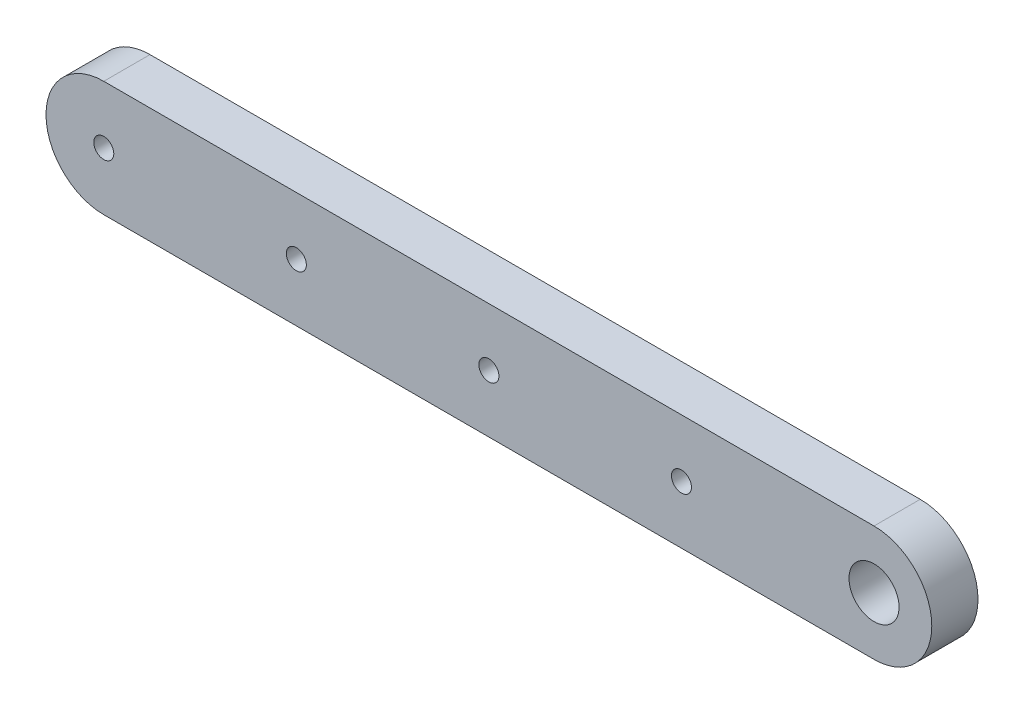
ISO-10303-21;
HEADER;
FILE_DESCRIPTION(('STEP AP214'),'2;1');
FILE_NAME('part.step','',(''),(''),'','','');
FILE_SCHEMA(('AUTOMOTIVE_DESIGN { 1 0 10303 214 1 1 1 1 }'));
ENDSEC;
DATA;
#1=APPLICATION_CONTEXT('core data for automotive mechanical design processes');
#2=APPLICATION_PROTOCOL_DEFINITION('international standard','automotive_design',2000,#1);
#3=PRODUCT_CONTEXT('',#1,'mechanical');
#4=PRODUCT('Part','Part','',(#3));
#5=PRODUCT_RELATED_PRODUCT_CATEGORY('part','',(#4));
#6=PRODUCT_DEFINITION_FORMATION('','',#4);
#7=PRODUCT_DEFINITION_CONTEXT('part definition',#1,'design');
#8=PRODUCT_DEFINITION('design','',#6,#7);
#9=PRODUCT_DEFINITION_SHAPE('','',#8);
#10=(LENGTH_UNIT() NAMED_UNIT(*) SI_UNIT(.MILLI.,.METRE.));
#11=(NAMED_UNIT(*) PLANE_ANGLE_UNIT() SI_UNIT($,.RADIAN.));
#12=(NAMED_UNIT(*) SI_UNIT($,.STERADIAN.) SOLID_ANGLE_UNIT());
#13=UNCERTAINTY_MEASURE_WITH_UNIT(LENGTH_MEASURE(1.E-05),#10,'distance_accuracy_value','');
#14=(GEOMETRIC_REPRESENTATION_CONTEXT(3) GLOBAL_UNCERTAINTY_ASSIGNED_CONTEXT((#13)) GLOBAL_UNIT_ASSIGNED_CONTEXT((#10,
#11,#12)) REPRESENTATION_CONTEXT('',''));
#15=CARTESIAN_POINT('',(0.,0.,0.));
#16=DIRECTION('',(0.,0.,1.));
#17=DIRECTION('',(1.,0.,0.));
#18=AXIS2_PLACEMENT_3D('',#15,#16,#17);
#19=CARTESIAN_POINT('',(0.,-7.5,6.));
#20=DIRECTION('',(0.,-1.,0.));
#21=DIRECTION('',(0.,0.,-1.));
#22=AXIS2_PLACEMENT_3D('',#19,#20,#21);
#23=PLANE('',#22);
#24=DIRECTION('',(-1.,0.,0.));
#25=VECTOR('',#24,1.);
#26=CARTESIAN_POINT('',(0.,-7.5,0.));
#27=LINE('',#26,#25);
#28=CARTESIAN_POINT('',(100.,-7.50000000000001,0.));
#29=VERTEX_POINT('',#28);
#30=CARTESIAN_POINT('',(0.,-7.5,0.));
#31=VERTEX_POINT('',#30);
#32=EDGE_CURVE('E110',#29,#31,#27,.T.);
#33=ORIENTED_EDGE('',*,*,#32,.F.);
#34=DIRECTION('',(0.,0.,-1.));
#35=VECTOR('',#34,1.);
#36=CARTESIAN_POINT('',(100.,-7.50000000000001,6.));
#37=LINE('',#36,#35);
#38=CARTESIAN_POINT('',(100.,-7.50000000000001,6.));
#39=VERTEX_POINT('',#38);
#40=EDGE_CURVE('E11',#39,#29,#37,.T.);
#41=ORIENTED_EDGE('',*,*,#40,.F.);
#42=DIRECTION('',(-1.,0.,0.));
#43=VECTOR('',#42,1.);
#44=CARTESIAN_POINT('',(0.,-7.5,6.));
#45=LINE('',#44,#43);
#46=CARTESIAN_POINT('',(0.,-7.5,6.));
#47=VERTEX_POINT('',#46);
#48=EDGE_CURVE('E91',#39,#47,#45,.T.);
#49=ORIENTED_EDGE('',*,*,#48,.T.);
#50=DIRECTION('',(0.,0.,-1.));
#51=VECTOR('',#50,1.);
#52=CARTESIAN_POINT('',(0.,-7.5,6.));
#53=LINE('',#52,#51);
#54=EDGE_CURVE('E81',#47,#31,#53,.T.);
#55=ORIENTED_EDGE('',*,*,#54,.T.);
#56=EDGE_LOOP('',(#33,#41,#49,#55));
#57=FACE_BOUND('',#56,.T.);
#58=ADVANCED_FACE('F42',(#57),#23,.T.);
#59=CARTESIAN_POINT('',(100.,0.,6.));
#60=DIRECTION('',(0.,0.,-1.));
#61=DIRECTION('',(-1.,0.,0.));
#62=AXIS2_PLACEMENT_3D('',#59,#60,#61);
#63=CYLINDRICAL_SURFACE('',#62,7.50000000000001);
#64=CARTESIAN_POINT('',(100.,0.,0.));
#65=DIRECTION('',(0.,0.,1.));
#66=DIRECTION('',(1.,0.,0.));
#67=AXIS2_PLACEMENT_3D('',#64,#65,#66);
#68=CIRCLE('',#67,7.50000000000001);
#69=CARTESIAN_POINT('',(100.,7.50000000000001,0.));
#70=VERTEX_POINT('',#69);
#71=EDGE_CURVE('E98',#29,#70,#68,.T.);
#72=ORIENTED_EDGE('',*,*,#71,.T.);
#73=DIRECTION('',(0.,0.,-1.));
#74=VECTOR('',#73,1.);
#75=CARTESIAN_POINT('',(100.,7.50000000000001,6.));
#76=LINE('',#75,#74);
#77=CARTESIAN_POINT('',(100.,7.50000000000001,6.));
#78=VERTEX_POINT('',#77);
#79=EDGE_CURVE('E51',#78,#70,#76,.T.);
#80=ORIENTED_EDGE('',*,*,#79,.F.);
#81=CARTESIAN_POINT('',(100.,0.,6.));
#82=DIRECTION('',(0.,0.,1.));
#83=DIRECTION('',(1.,0.,0.));
#84=AXIS2_PLACEMENT_3D('',#81,#82,#83);
#85=CIRCLE('',#84,7.50000000000001);
#86=EDGE_CURVE('E86',#39,#78,#85,.T.);
#87=ORIENTED_EDGE('',*,*,#86,.F.);
#88=ORIENTED_EDGE('',*,*,#40,.T.);
#89=EDGE_LOOP('',(#72,#80,#87,#88));
#90=FACE_BOUND('',#89,.T.);
#91=ADVANCED_FACE('F96',(#90),#63,.T.);
#92=CARTESIAN_POINT('',(0.,7.5,6.));
#93=DIRECTION('',(0.,1.,0.));
#94=DIRECTION('',(0.,0.,1.));
#95=AXIS2_PLACEMENT_3D('',#92,#93,#94);
#96=PLANE('',#95);
#97=DIRECTION('',(1.,0.,0.));
#98=VECTOR('',#97,1.);
#99=CARTESIAN_POINT('',(0.,7.5,0.));
#100=LINE('',#99,#98);
#101=CARTESIAN_POINT('',(0.,7.5,0.));
#102=VERTEX_POINT('',#101);
#103=EDGE_CURVE('E117',#102,#70,#100,.T.);
#104=ORIENTED_EDGE('',*,*,#103,.F.);
#105=DIRECTION('',(0.,0.,-1.));
#106=VECTOR('',#105,1.);
#107=CARTESIAN_POINT('',(0.,7.5,6.));
#108=LINE('',#107,#106);
#109=CARTESIAN_POINT('',(0.,7.5,6.));
#110=VERTEX_POINT('',#109);
#111=EDGE_CURVE('E74',#110,#102,#108,.T.);
#112=ORIENTED_EDGE('',*,*,#111,.F.);
#113=DIRECTION('',(1.,0.,0.));
#114=VECTOR('',#113,1.);
#115=CARTESIAN_POINT('',(0.,7.5,6.));
#116=LINE('',#115,#114);
#117=EDGE_CURVE('E90',#110,#78,#116,.T.);
#118=ORIENTED_EDGE('',*,*,#117,.T.);
#119=ORIENTED_EDGE('',*,*,#79,.T.);
#120=EDGE_LOOP('',(#104,#112,#118,#119));
#121=FACE_BOUND('',#120,.T.);
#122=ADVANCED_FACE('F103',(#121),#96,.T.);
#123=CARTESIAN_POINT('',(0.,0.,6.));
#124=DIRECTION('',(0.,0.,-1.));
#125=DIRECTION('',(-1.,0.,0.));
#126=AXIS2_PLACEMENT_3D('',#123,#124,#125);
#127=CYLINDRICAL_SURFACE('',#126,7.5);
#128=CARTESIAN_POINT('',(0.,0.,0.));
#129=DIRECTION('',(0.,0.,1.));
#130=DIRECTION('',(1.,0.,0.));
#131=AXIS2_PLACEMENT_3D('',#128,#129,#130);
#132=CIRCLE('',#131,7.5);
#133=EDGE_CURVE('E120',#102,#31,#132,.T.);
#134=ORIENTED_EDGE('',*,*,#133,.T.);
#135=ORIENTED_EDGE('',*,*,#54,.F.);
#136=CARTESIAN_POINT('',(0.,0.,6.));
#137=DIRECTION('',(0.,0.,1.));
#138=DIRECTION('',(1.,0.,0.));
#139=AXIS2_PLACEMENT_3D('',#136,#137,#138);
#140=CIRCLE('',#139,7.5);
#141=EDGE_CURVE('E59',#110,#47,#140,.T.);
#142=ORIENTED_EDGE('',*,*,#141,.F.);
#143=ORIENTED_EDGE('',*,*,#111,.T.);
#144=EDGE_LOOP('',(#134,#135,#142,#143));
#145=FACE_BOUND('',#144,.T.);
#146=ADVANCED_FACE('F180',(#145),#127,.T.);
#147=CARTESIAN_POINT('',(0.,0.,6.));
#148=DIRECTION('',(0.,0.,1.));
#149=DIRECTION('',(1.,0.,0.));
#150=AXIS2_PLACEMENT_3D('',#147,#148,#149);
#151=PLANE('',#150);
#152=CARTESIAN_POINT('',(100.,0.,6.));
#153=DIRECTION('',(0.,0.,1.));
#154=DIRECTION('',(1.,0.,0.));
#155=AXIS2_PLACEMENT_3D('',#152,#153,#154);
#156=CIRCLE('',#155,3.25000000000001);
#157=CARTESIAN_POINT('',(103.25,0.,6.));
#158=VERTEX_POINT('',#157);
#159=EDGE_CURVE('E160',#158,#158,#156,.T.);
#160=ORIENTED_EDGE('',*,*,#159,.F.);
#161=EDGE_LOOP('',(#160));
#162=FACE_BOUND('',#161,.T.);
#163=CARTESIAN_POINT('',(25.,0.,6.));
#164=DIRECTION('',(0.,0.,1.));
#165=DIRECTION('',(1.,0.,0.));
#166=AXIS2_PLACEMENT_3D('',#163,#164,#165);
#167=CIRCLE('',#166,1.3);
#168=CARTESIAN_POINT('',(26.3,0.,6.));
#169=VERTEX_POINT('',#168);
#170=EDGE_CURVE('E145',#169,#169,#167,.T.);
#171=ORIENTED_EDGE('',*,*,#170,.F.);
#172=EDGE_LOOP('',(#171));
#173=FACE_BOUND('',#172,.T.);
#174=CARTESIAN_POINT('',(75.,0.,6.));
#175=DIRECTION('',(0.,0.,1.));
#176=DIRECTION('',(1.,0.,0.));
#177=AXIS2_PLACEMENT_3D('',#174,#175,#176);
#178=CIRCLE('',#177,1.3);
#179=CARTESIAN_POINT('',(76.3,0.,6.));
#180=VERTEX_POINT('',#179);
#181=EDGE_CURVE('E146',#180,#180,#178,.T.);
#182=ORIENTED_EDGE('',*,*,#181,.F.);
#183=EDGE_LOOP('',(#182));
#184=FACE_BOUND('',#183,.T.);
#185=CARTESIAN_POINT('',(50.,0.,6.));
#186=DIRECTION('',(0.,0.,1.));
#187=DIRECTION('',(1.,0.,0.));
#188=AXIS2_PLACEMENT_3D('',#185,#186,#187);
#189=CIRCLE('',#188,1.3);
#190=CARTESIAN_POINT('',(51.3,0.,6.));
#191=VERTEX_POINT('',#190);
#192=EDGE_CURVE('E136',#191,#191,#189,.T.);
#193=ORIENTED_EDGE('',*,*,#192,.F.);
#194=EDGE_LOOP('',(#193));
#195=FACE_BOUND('',#194,.T.);
#196=CARTESIAN_POINT('',(0.,0.,6.));
#197=DIRECTION('',(0.,0.,1.));
#198=DIRECTION('',(1.,0.,0.));
#199=AXIS2_PLACEMENT_3D('',#196,#197,#198);
#200=CIRCLE('',#199,1.3);
#201=CARTESIAN_POINT('',(1.3,0.,6.));
#202=VERTEX_POINT('',#201);
#203=EDGE_CURVE('E128',#202,#202,#200,.T.);
#204=ORIENTED_EDGE('',*,*,#203,.F.);
#205=EDGE_LOOP('',(#204));
#206=FACE_BOUND('',#205,.T.);
#207=ORIENTED_EDGE('',*,*,#48,.F.);
#208=ORIENTED_EDGE('',*,*,#86,.T.);
#209=ORIENTED_EDGE('',*,*,#117,.F.);
#210=ORIENTED_EDGE('',*,*,#141,.T.);
#211=EDGE_LOOP('',(#207,#208,#209,#210));
#212=FACE_BOUND('',#211,.T.);
#213=ADVANCED_FACE('F88',(#162,#173,#184,#195,#206,#212),#151,.T.);
#214=CARTESIAN_POINT('',(0.,0.,0.));
#215=DIRECTION('',(0.,0.,1.));
#216=DIRECTION('',(1.,0.,0.));
#217=AXIS2_PLACEMENT_3D('',#214,#215,#216);
#218=PLANE('',#217);
#219=CARTESIAN_POINT('',(100.,0.,0.));
#220=DIRECTION('',(0.,0.,1.));
#221=DIRECTION('',(1.,0.,0.));
#222=AXIS2_PLACEMENT_3D('',#219,#220,#221);
#223=CIRCLE('',#222,3.25000000000001);
#224=CARTESIAN_POINT('',(103.25,0.,0.));
#225=VERTEX_POINT('',#224);
#226=EDGE_CURVE('E150',#225,#225,#223,.T.);
#227=ORIENTED_EDGE('',*,*,#226,.T.);
#228=EDGE_LOOP('',(#227));
#229=FACE_BOUND('',#228,.T.);
#230=CARTESIAN_POINT('',(25.,0.,0.));
#231=DIRECTION('',(0.,0.,1.));
#232=DIRECTION('',(1.,0.,0.));
#233=AXIS2_PLACEMENT_3D('',#230,#231,#232);
#234=CIRCLE('',#233,1.3);
#235=CARTESIAN_POINT('',(26.3,0.,0.));
#236=VERTEX_POINT('',#235);
#237=EDGE_CURVE('E132',#236,#236,#234,.T.);
#238=ORIENTED_EDGE('',*,*,#237,.T.);
#239=EDGE_LOOP('',(#238));
#240=FACE_BOUND('',#239,.T.);
#241=CARTESIAN_POINT('',(75.,0.,0.));
#242=DIRECTION('',(0.,0.,1.));
#243=DIRECTION('',(1.,0.,0.));
#244=AXIS2_PLACEMENT_3D('',#241,#242,#243);
#245=CIRCLE('',#244,1.3);
#246=CARTESIAN_POINT('',(76.3,0.,0.));
#247=VERTEX_POINT('',#246);
#248=EDGE_CURVE('E141',#247,#247,#245,.T.);
#249=ORIENTED_EDGE('',*,*,#248,.T.);
#250=EDGE_LOOP('',(#249));
#251=FACE_BOUND('',#250,.T.);
#252=CARTESIAN_POINT('',(50.,0.,0.));
#253=DIRECTION('',(0.,0.,1.));
#254=DIRECTION('',(1.,0.,0.));
#255=AXIS2_PLACEMENT_3D('',#252,#253,#254);
#256=CIRCLE('',#255,1.3);
#257=CARTESIAN_POINT('',(51.3,0.,0.));
#258=VERTEX_POINT('',#257);
#259=EDGE_CURVE('E140',#258,#258,#256,.T.);
#260=ORIENTED_EDGE('',*,*,#259,.T.);
#261=EDGE_LOOP('',(#260));
#262=FACE_BOUND('',#261,.T.);
#263=CARTESIAN_POINT('',(0.,0.,0.));
#264=DIRECTION('',(0.,0.,1.));
#265=DIRECTION('',(1.,0.,0.));
#266=AXIS2_PLACEMENT_3D('',#263,#264,#265);
#267=CIRCLE('',#266,1.3);
#268=CARTESIAN_POINT('',(1.3,0.,0.));
#269=VERTEX_POINT('',#268);
#270=EDGE_CURVE('E114',#269,#269,#267,.T.);
#271=ORIENTED_EDGE('',*,*,#270,.T.);
#272=EDGE_LOOP('',(#271));
#273=FACE_BOUND('',#272,.T.);
#274=ORIENTED_EDGE('',*,*,#32,.T.);
#275=ORIENTED_EDGE('',*,*,#133,.F.);
#276=ORIENTED_EDGE('',*,*,#103,.T.);
#277=ORIENTED_EDGE('',*,*,#71,.F.);
#278=EDGE_LOOP('',(#274,#275,#276,#277));
#279=FACE_BOUND('',#278,.T.);
#280=ADVANCED_FACE('F168',(#229,#240,#251,#262,#273,#279),#218,.F.);
#281=CARTESIAN_POINT('',(0.,0.,0.));
#282=DIRECTION('',(0.,0.,1.));
#283=DIRECTION('',(1.,0.,0.));
#284=AXIS2_PLACEMENT_3D('',#281,#282,#283);
#285=CYLINDRICAL_SURFACE('',#284,1.3);
#286=ORIENTED_EDGE('',*,*,#270,.F.);
#287=EDGE_LOOP('',(#286));
#288=FACE_BOUND('',#287,.T.);
#289=ORIENTED_EDGE('',*,*,#203,.T.);
#290=EDGE_LOOP('',(#289));
#291=FACE_BOUND('',#290,.T.);
#292=ADVANCED_FACE('F190',(#288,#291),#285,.F.);
#293=CARTESIAN_POINT('',(50.,0.,0.));
#294=DIRECTION('',(0.,0.,1.));
#295=DIRECTION('',(1.,0.,0.));
#296=AXIS2_PLACEMENT_3D('',#293,#294,#295);
#297=CYLINDRICAL_SURFACE('',#296,1.3);
#298=ORIENTED_EDGE('',*,*,#259,.F.);
#299=EDGE_LOOP('',(#298));
#300=FACE_BOUND('',#299,.T.);
#301=ORIENTED_EDGE('',*,*,#192,.T.);
#302=EDGE_LOOP('',(#301));
#303=FACE_BOUND('',#302,.T.);
#304=ADVANCED_FACE('F192',(#300,#303),#297,.F.);
#305=CARTESIAN_POINT('',(75.,0.,0.));
#306=DIRECTION('',(0.,0.,1.));
#307=DIRECTION('',(1.,0.,0.));
#308=AXIS2_PLACEMENT_3D('',#305,#306,#307);
#309=CYLINDRICAL_SURFACE('',#308,1.3);
#310=ORIENTED_EDGE('',*,*,#248,.F.);
#311=EDGE_LOOP('',(#310));
#312=FACE_BOUND('',#311,.T.);
#313=ORIENTED_EDGE('',*,*,#181,.T.);
#314=EDGE_LOOP('',(#313));
#315=FACE_BOUND('',#314,.T.);
#316=ADVANCED_FACE('F199',(#312,#315),#309,.F.);
#317=CARTESIAN_POINT('',(25.,0.,0.));
#318=DIRECTION('',(0.,0.,1.));
#319=DIRECTION('',(1.,0.,0.));
#320=AXIS2_PLACEMENT_3D('',#317,#318,#319);
#321=CYLINDRICAL_SURFACE('',#320,1.3);
#322=ORIENTED_EDGE('',*,*,#237,.F.);
#323=EDGE_LOOP('',(#322));
#324=FACE_BOUND('',#323,.T.);
#325=ORIENTED_EDGE('',*,*,#170,.T.);
#326=EDGE_LOOP('',(#325));
#327=FACE_BOUND('',#326,.T.);
#328=ADVANCED_FACE('F174',(#324,#327),#321,.F.);
#329=CARTESIAN_POINT('',(100.,0.,0.));
#330=DIRECTION('',(0.,0.,1.));
#331=DIRECTION('',(1.,0.,0.));
#332=AXIS2_PLACEMENT_3D('',#329,#330,#331);
#333=CYLINDRICAL_SURFACE('',#332,3.25000000000001);
#334=ORIENTED_EDGE('',*,*,#226,.F.);
#335=EDGE_LOOP('',(#334));
#336=FACE_BOUND('',#335,.T.);
#337=ORIENTED_EDGE('',*,*,#159,.T.);
#338=EDGE_LOOP('',(#337));
#339=FACE_BOUND('',#338,.T.);
#340=ADVANCED_FACE('F171',(#336,#339),#333,.F.);
#341=CLOSED_SHELL('',(#58,#91,#122,#146,#213,#280,#292,#304,#316,#328,#340));
#342=MANIFOLD_SOLID_BREP('B2',#341);
#343=ADVANCED_BREP_SHAPE_REPRESENTATION('',(#18,#342),#14);
#344=SHAPE_DEFINITION_REPRESENTATION(#9,#343);
ENDSEC;
END-ISO-10303-21;
